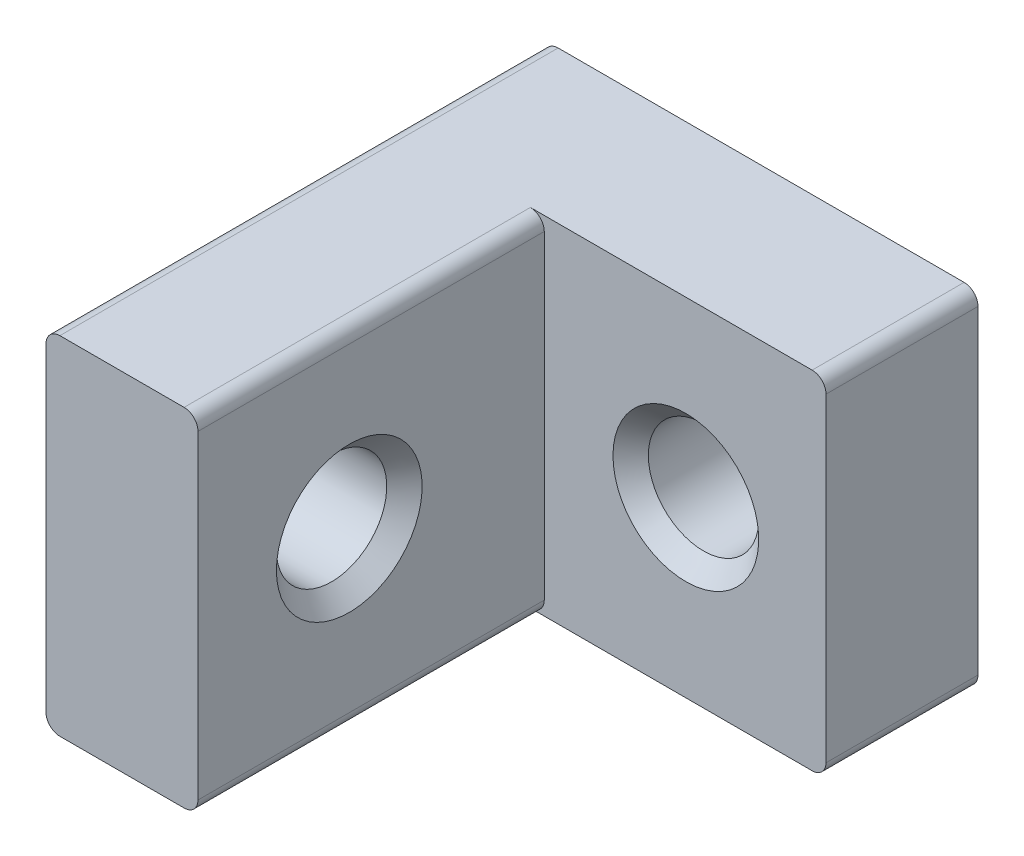
ISO-10303-21;
HEADER;
FILE_DESCRIPTION(('STEP AP214'),'2;1');
FILE_NAME('part.step','',(''),(''),'','','');
FILE_SCHEMA(('AUTOMOTIVE_DESIGN { 1 0 10303 214 1 1 1 1 }'));
ENDSEC;
DATA;
#1=APPLICATION_CONTEXT('core data for automotive mechanical design processes');
#2=APPLICATION_PROTOCOL_DEFINITION('international standard','automotive_design',2000,#1);
#3=PRODUCT_CONTEXT('',#1,'mechanical');
#4=PRODUCT('Part','Part','',(#3));
#5=PRODUCT_RELATED_PRODUCT_CATEGORY('part','',(#4));
#6=PRODUCT_DEFINITION_FORMATION('','',#4);
#7=PRODUCT_DEFINITION_CONTEXT('part definition',#1,'design');
#8=PRODUCT_DEFINITION('design','',#6,#7);
#9=PRODUCT_DEFINITION_SHAPE('','',#8);
#10=(LENGTH_UNIT() NAMED_UNIT(*) SI_UNIT(.MILLI.,.METRE.));
#11=(NAMED_UNIT(*) PLANE_ANGLE_UNIT() SI_UNIT($,.RADIAN.));
#12=(NAMED_UNIT(*) SI_UNIT($,.STERADIAN.) SOLID_ANGLE_UNIT());
#13=UNCERTAINTY_MEASURE_WITH_UNIT(LENGTH_MEASURE(1.E-05),#10,'distance_accuracy_value','');
#14=(GEOMETRIC_REPRESENTATION_CONTEXT(3) GLOBAL_UNCERTAINTY_ASSIGNED_CONTEXT((#13)) GLOBAL_UNIT_ASSIGNED_CONTEXT((#10,
#11,#12)) REPRESENTATION_CONTEXT('',''));
#15=CARTESIAN_POINT('',(0.,0.,0.));
#16=DIRECTION('',(0.,0.,1.));
#17=DIRECTION('',(1.,0.,0.));
#18=AXIS2_PLACEMENT_3D('',#15,#16,#17);
#19=CARTESIAN_POINT('',(0.381,6.35,0.));
#20=DIRECTION('',(1.,0.,0.));
#21=DIRECTION('',(0.,0.,-1.));
#22=AXIS2_PLACEMENT_3D('',#19,#20,#21);
#23=PLANE('',#22);
#24=CARTESIAN_POINT('',(0.381000000000002,0.,12.7));
#25=DIRECTION('',(-1.,0.,0.));
#26=DIRECTION('',(0.,0.,1.));
#27=AXIS2_PLACEMENT_3D('',#24,#25,#26);
#28=CIRCLE('',#27,2.667);
#29=CARTESIAN_POINT('',(0.381000000000002,0.,15.367));
#30=VERTEX_POINT('',#29);
#31=EDGE_CURVE('E252',#30,#30,#28,.T.);
#32=ORIENTED_EDGE('',*,*,#31,.F.);
#33=EDGE_LOOP('',(#32));
#34=FACE_BOUND('',#33,.T.);
#35=DIRECTION('',(0.,-1.,0.));
#36=VECTOR('',#35,1.);
#37=CARTESIAN_POINT('',(0.381,6.35,0.));
#38=LINE('',#37,#36);
#39=CARTESIAN_POINT('',(0.381,5.842,0.));
#40=VERTEX_POINT('',#39);
#41=CARTESIAN_POINT('',(0.381,-5.842,0.));
#42=VERTEX_POINT('',#41);
#43=EDGE_CURVE('E222',#40,#42,#38,.T.);
#44=ORIENTED_EDGE('',*,*,#43,.T.);
#45=DIRECTION('',(0.,0.,1.));
#46=VECTOR('',#45,1.);
#47=CARTESIAN_POINT('',(0.381,-5.842,0.));
#48=LINE('',#47,#46);
#49=CARTESIAN_POINT('',(0.381000000000002,-5.842,18.2372));
#50=VERTEX_POINT('',#49);
#51=EDGE_CURVE('E146',#42,#50,#48,.T.);
#52=ORIENTED_EDGE('',*,*,#51,.T.);
#53=DIRECTION('',(0.,-1.,0.));
#54=VECTOR('',#53,1.);
#55=CARTESIAN_POINT('',(0.381000000000002,6.35,18.2372));
#56=LINE('',#55,#54);
#57=CARTESIAN_POINT('',(0.381000000000002,5.842,18.2372));
#58=VERTEX_POINT('',#57);
#59=EDGE_CURVE('E130',#58,#50,#56,.T.);
#60=ORIENTED_EDGE('',*,*,#59,.F.);
#61=DIRECTION('',(0.,0.,1.));
#62=VECTOR('',#61,1.);
#63=CARTESIAN_POINT('',(0.381,5.842,0.));
#64=LINE('',#63,#62);
#65=EDGE_CURVE('E143',#58,#40,#64,.F.);
#66=ORIENTED_EDGE('',*,*,#65,.T.);
#67=EDGE_LOOP('',(#44,#52,#60,#66));
#68=FACE_BOUND('',#67,.T.);
#69=ADVANCED_FACE('F36',(#34,#68),#23,.F.);
#70=CARTESIAN_POINT('',(0.381000000000002,6.35,18.2372));
#71=DIRECTION('',(0.,0.,-1.));
#72=DIRECTION('',(-1.,0.,0.));
#73=AXIS2_PLACEMENT_3D('',#70,#71,#72);
#74=PLANE('',#73);
#75=ORIENTED_EDGE('',*,*,#59,.T.);
#76=CARTESIAN_POINT('',(0.889000000000002,-5.842,18.2372));
#77=DIRECTION('',(0.,0.,-1.));
#78=DIRECTION('',(-1.,0.,0.));
#79=AXIS2_PLACEMENT_3D('',#76,#77,#78);
#80=CIRCLE('',#79,0.508);
#81=CARTESIAN_POINT('',(0.889000000000002,-6.35,18.2372));
#82=VERTEX_POINT('',#81);
#83=EDGE_CURVE('E137',#50,#82,#80,.F.);
#84=ORIENTED_EDGE('',*,*,#83,.T.);
#85=DIRECTION('',(1.,0.,0.));
#86=VECTOR('',#85,1.);
#87=CARTESIAN_POINT('',(0.381000000000002,-6.35,18.2372));
#88=LINE('',#87,#86);
#89=CARTESIAN_POINT('',(5.4356,-6.35,18.2372));
#90=VERTEX_POINT('',#89);
#91=EDGE_CURVE('E205',#82,#90,#88,.T.);
#92=ORIENTED_EDGE('',*,*,#91,.T.);
#93=CARTESIAN_POINT('',(5.4356,-5.842,18.2372));
#94=DIRECTION('',(0.,0.,-1.));
#95=DIRECTION('',(-1.,0.,0.));
#96=AXIS2_PLACEMENT_3D('',#93,#94,#95);
#97=CIRCLE('',#96,0.508);
#98=CARTESIAN_POINT('',(5.9436,-5.842,18.2372));
#99=VERTEX_POINT('',#98);
#100=EDGE_CURVE('E138',#90,#99,#97,.F.);
#101=ORIENTED_EDGE('',*,*,#100,.T.);
#102=DIRECTION('',(0.,-1.,0.));
#103=VECTOR('',#102,1.);
#104=CARTESIAN_POINT('',(5.9436,6.35,18.2372));
#105=LINE('',#104,#103);
#106=CARTESIAN_POINT('',(5.9436,5.842,18.2372));
#107=VERTEX_POINT('',#106);
#108=EDGE_CURVE('E148',#107,#99,#105,.T.);
#109=ORIENTED_EDGE('',*,*,#108,.F.);
#110=CARTESIAN_POINT('',(5.4356,5.842,18.2372));
#111=DIRECTION('',(0.,0.,-1.));
#112=DIRECTION('',(-1.,0.,0.));
#113=AXIS2_PLACEMENT_3D('',#110,#111,#112);
#114=CIRCLE('',#113,0.508);
#115=CARTESIAN_POINT('',(5.4356,6.35,18.2372));
#116=VERTEX_POINT('',#115);
#117=EDGE_CURVE('E154',#107,#116,#114,.F.);
#118=ORIENTED_EDGE('',*,*,#117,.T.);
#119=DIRECTION('',(1.,0.,0.));
#120=VECTOR('',#119,1.);
#121=CARTESIAN_POINT('',(0.381000000000002,6.35,18.2372));
#122=LINE('',#121,#120);
#123=CARTESIAN_POINT('',(0.889000000000002,6.35,18.2372));
#124=VERTEX_POINT('',#123);
#125=EDGE_CURVE('E132',#124,#116,#122,.T.);
#126=ORIENTED_EDGE('',*,*,#125,.F.);
#127=CARTESIAN_POINT('',(0.889000000000002,5.842,18.2372));
#128=DIRECTION('',(0.,0.,-1.));
#129=DIRECTION('',(-1.,0.,0.));
#130=AXIS2_PLACEMENT_3D('',#127,#128,#129);
#131=CIRCLE('',#130,0.508);
#132=EDGE_CURVE('E127',#124,#58,#131,.F.);
#133=ORIENTED_EDGE('',*,*,#132,.T.);
#134=EDGE_LOOP('',(#75,#84,#92,#101,#109,#118,#126,#133));
#135=FACE_BOUND('',#134,.T.);
#136=ADVANCED_FACE('F129',(#135),#74,.F.);
#137=CARTESIAN_POINT('',(5.9436,6.35,18.2372));
#138=DIRECTION('',(-1.,0.,0.));
#139=DIRECTION('',(0.,0.,1.));
#140=AXIS2_PLACEMENT_3D('',#137,#138,#139);
#141=PLANE('',#140);
#142=CARTESIAN_POINT('',(5.9436,0.,12.7));
#143=DIRECTION('',(-1.,0.,0.));
#144=DIRECTION('',(0.,0.,1.));
#145=AXIS2_PLACEMENT_3D('',#142,#143,#144);
#146=CIRCLE('',#145,2.667);
#147=CARTESIAN_POINT('',(5.9436,0.,15.367));
#148=VERTEX_POINT('',#147);
#149=EDGE_CURVE('E209',#148,#148,#146,.T.);
#150=ORIENTED_EDGE('',*,*,#149,.T.);
#151=EDGE_LOOP('',(#150));
#152=FACE_BOUND('',#151,.T.);
#153=ORIENTED_EDGE('',*,*,#108,.T.);
#154=DIRECTION('',(0.,0.,-1.));
#155=VECTOR('',#154,1.);
#156=CARTESIAN_POINT('',(5.9436,-5.842,18.2372));
#157=LINE('',#156,#155);
#158=CARTESIAN_POINT('',(5.9436,-5.842,5.5626));
#159=VERTEX_POINT('',#158);
#160=EDGE_CURVE('E193',#99,#159,#157,.T.);
#161=ORIENTED_EDGE('',*,*,#160,.T.);
#162=DIRECTION('',(0.,-1.,0.));
#163=VECTOR('',#162,1.);
#164=CARTESIAN_POINT('',(5.9436,6.35,5.5626));
#165=LINE('',#164,#163);
#166=CARTESIAN_POINT('',(5.9436,5.842,5.5626));
#167=VERTEX_POINT('',#166);
#168=EDGE_CURVE('E198',#167,#159,#165,.T.);
#169=ORIENTED_EDGE('',*,*,#168,.F.);
#170=DIRECTION('',(0.,0.,-1.));
#171=VECTOR('',#170,1.);
#172=CARTESIAN_POINT('',(5.9436,5.842,18.2372));
#173=LINE('',#172,#171);
#174=EDGE_CURVE('E191',#167,#107,#173,.F.);
#175=ORIENTED_EDGE('',*,*,#174,.T.);
#176=EDGE_LOOP('',(#153,#161,#169,#175));
#177=FACE_BOUND('',#176,.T.);
#178=ADVANCED_FACE('F234',(#152,#177),#141,.F.);
#179=CARTESIAN_POINT('',(5.9436,6.35,5.5626));
#180=DIRECTION('',(0.,0.,-1.));
#181=DIRECTION('',(-1.,0.,0.));
#182=AXIS2_PLACEMENT_3D('',#179,#180,#181);
#183=PLANE('',#182);
#184=CARTESIAN_POINT('',(11.1252,0.,5.5626));
#185=DIRECTION('',(0.,0.,-1.));
#186=DIRECTION('',(-1.,0.,0.));
#187=AXIS2_PLACEMENT_3D('',#184,#185,#186);
#188=CIRCLE('',#187,2.667);
#189=CARTESIAN_POINT('',(8.4582,0.,5.5626));
#190=VERTEX_POINT('',#189);
#191=EDGE_CURVE('E256',#190,#190,#188,.T.);
#192=ORIENTED_EDGE('',*,*,#191,.T.);
#193=EDGE_LOOP('',(#192));
#194=FACE_BOUND('',#193,.T.);
#195=DIRECTION('',(1.,0.,0.));
#196=VECTOR('',#195,1.);
#197=CARTESIAN_POINT('',(5.9436,-6.35,5.5626));
#198=LINE('',#197,#196);
#199=CARTESIAN_POINT('',(5.4356,-6.35,5.5626));
#200=VERTEX_POINT('',#199);
#201=CARTESIAN_POINT('',(15.748,-6.35,5.5626));
#202=VERTEX_POINT('',#201);
#203=EDGE_CURVE('E196',#200,#202,#198,.T.);
#204=ORIENTED_EDGE('',*,*,#203,.T.);
#205=CARTESIAN_POINT('',(15.748,-5.842,5.5626));
#206=DIRECTION('',(0.,0.,-1.));
#207=DIRECTION('',(-1.,0.,0.));
#208=AXIS2_PLACEMENT_3D('',#205,#206,#207);
#209=CIRCLE('',#208,0.508);
#210=CARTESIAN_POINT('',(16.256,-5.842,5.5626));
#211=VERTEX_POINT('',#210);
#212=EDGE_CURVE('E189',#202,#211,#209,.F.);
#213=ORIENTED_EDGE('',*,*,#212,.T.);
#214=DIRECTION('',(0.,-1.,0.));
#215=VECTOR('',#214,1.);
#216=CARTESIAN_POINT('',(16.256,6.35,5.5626));
#217=LINE('',#216,#215);
#218=CARTESIAN_POINT('',(16.256,5.842,5.5626));
#219=VERTEX_POINT('',#218);
#220=EDGE_CURVE('E229',#219,#211,#217,.T.);
#221=ORIENTED_EDGE('',*,*,#220,.F.);
#222=CARTESIAN_POINT('',(15.748,5.842,5.5626));
#223=DIRECTION('',(0.,0.,-1.));
#224=DIRECTION('',(-1.,0.,0.));
#225=AXIS2_PLACEMENT_3D('',#222,#223,#224);
#226=CIRCLE('',#225,0.508);
#227=CARTESIAN_POINT('',(15.748,6.35,5.5626));
#228=VERTEX_POINT('',#227);
#229=EDGE_CURVE('E187',#219,#228,#226,.F.);
#230=ORIENTED_EDGE('',*,*,#229,.T.);
#231=DIRECTION('',(1.,0.,0.));
#232=VECTOR('',#231,1.);
#233=CARTESIAN_POINT('',(5.9436,6.35,5.5626));
#234=LINE('',#233,#232);
#235=CARTESIAN_POINT('',(5.4356,6.35,5.5626));
#236=VERTEX_POINT('',#235);
#237=EDGE_CURVE('E243',#236,#228,#234,.T.);
#238=ORIENTED_EDGE('',*,*,#237,.F.);
#239=CARTESIAN_POINT('',(5.4356,5.842,5.5626));
#240=DIRECTION('',(0.,0.,-1.));
#241=DIRECTION('',(-1.,0.,0.));
#242=AXIS2_PLACEMENT_3D('',#239,#240,#241);
#243=CIRCLE('',#242,0.508);
#244=EDGE_CURVE('E11',#236,#167,#243,.T.);
#245=ORIENTED_EDGE('',*,*,#244,.T.);
#246=ORIENTED_EDGE('',*,*,#168,.T.);
#247=CARTESIAN_POINT('',(5.4356,-5.842,5.5626));
#248=DIRECTION('',(0.,0.,-1.));
#249=DIRECTION('',(-1.,0.,0.));
#250=AXIS2_PLACEMENT_3D('',#247,#248,#249);
#251=CIRCLE('',#250,0.508);
#252=EDGE_CURVE('E44',#159,#200,#251,.T.);
#253=ORIENTED_EDGE('',*,*,#252,.T.);
#254=EDGE_LOOP('',(#204,#213,#221,#230,#238,#245,#246,#253));
#255=FACE_BOUND('',#254,.T.);
#256=ADVANCED_FACE('F195',(#194,#255),#183,.F.);
#257=CARTESIAN_POINT('',(16.256,6.35,0.));
#258=DIRECTION('',(-1.,0.,0.));
#259=DIRECTION('',(0.,0.,1.));
#260=AXIS2_PLACEMENT_3D('',#257,#258,#259);
#261=PLANE('',#260);
#262=ORIENTED_EDGE('',*,*,#220,.T.);
#263=DIRECTION('',(0.,0.,-1.));
#264=VECTOR('',#263,1.);
#265=CARTESIAN_POINT('',(16.256,-5.842,0.));
#266=LINE('',#265,#264);
#267=CARTESIAN_POINT('',(16.256,-5.842,0.));
#268=VERTEX_POINT('',#267);
#269=EDGE_CURVE('E184',#211,#268,#266,.T.);
#270=ORIENTED_EDGE('',*,*,#269,.T.);
#271=DIRECTION('',(0.,-1.,0.));
#272=VECTOR('',#271,1.);
#273=CARTESIAN_POINT('',(16.256,6.35,0.));
#274=LINE('',#273,#272);
#275=CARTESIAN_POINT('',(16.256,5.842,0.));
#276=VERTEX_POINT('',#275);
#277=EDGE_CURVE('E225',#276,#268,#274,.T.);
#278=ORIENTED_EDGE('',*,*,#277,.F.);
#279=DIRECTION('',(0.,0.,-1.));
#280=VECTOR('',#279,1.);
#281=CARTESIAN_POINT('',(16.256,5.842,5.5626));
#282=LINE('',#281,#280);
#283=EDGE_CURVE('E182',#276,#219,#282,.F.);
#284=ORIENTED_EDGE('',*,*,#283,.T.);
#285=EDGE_LOOP('',(#262,#270,#278,#284));
#286=FACE_BOUND('',#285,.T.);
#287=ADVANCED_FACE('F277',(#286),#261,.F.);
#288=CARTESIAN_POINT('',(0.381,6.35,0.));
#289=DIRECTION('',(0.,0.,1.));
#290=DIRECTION('',(1.,0.,0.));
#291=AXIS2_PLACEMENT_3D('',#288,#289,#290);
#292=PLANE('',#291);
#293=CARTESIAN_POINT('',(11.1252,0.,0.));
#294=DIRECTION('',(0.,0.,-1.));
#295=DIRECTION('',(-1.,0.,0.));
#296=AXIS2_PLACEMENT_3D('',#293,#294,#295);
#297=CIRCLE('',#296,2.667);
#298=CARTESIAN_POINT('',(8.4582,0.,0.));
#299=VERTEX_POINT('',#298);
#300=EDGE_CURVE('E266',#299,#299,#297,.T.);
#301=ORIENTED_EDGE('',*,*,#300,.F.);
#302=EDGE_LOOP('',(#301));
#303=FACE_BOUND('',#302,.T.);
#304=DIRECTION('',(-1.,0.,0.));
#305=VECTOR('',#304,1.);
#306=CARTESIAN_POINT('',(0.381,-6.35,0.));
#307=LINE('',#306,#305);
#308=CARTESIAN_POINT('',(15.748,-6.35,0.));
#309=VERTEX_POINT('',#308);
#310=CARTESIAN_POINT('',(0.889,-6.35,0.));
#311=VERTEX_POINT('',#310);
#312=EDGE_CURVE('E211',#309,#311,#307,.T.);
#313=ORIENTED_EDGE('',*,*,#312,.T.);
#314=CARTESIAN_POINT('',(0.889,-5.842,0.));
#315=DIRECTION('',(0.,0.,1.));
#316=DIRECTION('',(1.,0.,0.));
#317=AXIS2_PLACEMENT_3D('',#314,#315,#316);
#318=CIRCLE('',#317,0.508);
#319=EDGE_CURVE('E172',#311,#42,#318,.F.);
#320=ORIENTED_EDGE('',*,*,#319,.T.);
#321=ORIENTED_EDGE('',*,*,#43,.F.);
#322=CARTESIAN_POINT('',(0.889,5.842,0.));
#323=DIRECTION('',(0.,0.,1.));
#324=DIRECTION('',(1.,0.,0.));
#325=AXIS2_PLACEMENT_3D('',#322,#323,#324);
#326=CIRCLE('',#325,0.508);
#327=CARTESIAN_POINT('',(0.889,6.35,0.));
#328=VERTEX_POINT('',#327);
#329=EDGE_CURVE('E152',#40,#328,#326,.F.);
#330=ORIENTED_EDGE('',*,*,#329,.T.);
#331=DIRECTION('',(-1.,0.,0.));
#332=VECTOR('',#331,1.);
#333=CARTESIAN_POINT('',(0.381,6.35,0.));
#334=LINE('',#333,#332);
#335=CARTESIAN_POINT('',(15.748,6.35,0.));
#336=VERTEX_POINT('',#335);
#337=EDGE_CURVE('E217',#336,#328,#334,.T.);
#338=ORIENTED_EDGE('',*,*,#337,.F.);
#339=CARTESIAN_POINT('',(15.748,5.842,0.));
#340=DIRECTION('',(0.,0.,1.));
#341=DIRECTION('',(1.,0.,0.));
#342=AXIS2_PLACEMENT_3D('',#339,#340,#341);
#343=CIRCLE('',#342,0.508);
#344=EDGE_CURVE('E167',#336,#276,#343,.F.);
#345=ORIENTED_EDGE('',*,*,#344,.T.);
#346=ORIENTED_EDGE('',*,*,#277,.T.);
#347=CARTESIAN_POINT('',(15.748,-5.842,0.));
#348=DIRECTION('',(0.,0.,1.));
#349=DIRECTION('',(1.,0.,0.));
#350=AXIS2_PLACEMENT_3D('',#347,#348,#349);
#351=CIRCLE('',#350,0.508);
#352=EDGE_CURVE('E169',#268,#309,#351,.F.);
#353=ORIENTED_EDGE('',*,*,#352,.T.);
#354=EDGE_LOOP('',(#313,#320,#321,#330,#338,#345,#346,#353));
#355=FACE_BOUND('',#354,.T.);
#356=ADVANCED_FACE('F274',(#303,#355),#292,.F.);
#357=CARTESIAN_POINT('',(0.381000000000002,6.35,18.2372));
#358=DIRECTION('',(0.,1.,0.));
#359=DIRECTION('',(0.,0.,1.));
#360=AXIS2_PLACEMENT_3D('',#357,#358,#359);
#361=PLANE('',#360);
#362=ORIENTED_EDGE('',*,*,#337,.T.);
#363=DIRECTION('',(0.,0.,1.));
#364=VECTOR('',#363,1.);
#365=CARTESIAN_POINT('',(0.889000000000002,6.35,18.2372));
#366=LINE('',#365,#364);
#367=EDGE_CURVE('E180',#328,#124,#366,.T.);
#368=ORIENTED_EDGE('',*,*,#367,.T.);
#369=ORIENTED_EDGE('',*,*,#125,.T.);
#370=DIRECTION('',(0.,0.,-1.));
#371=VECTOR('',#370,1.);
#372=CARTESIAN_POINT('',(5.4356,6.35,5.5626));
#373=LINE('',#372,#371);
#374=EDGE_CURVE('E174',#116,#236,#373,.T.);
#375=ORIENTED_EDGE('',*,*,#374,.T.);
#376=ORIENTED_EDGE('',*,*,#237,.T.);
#377=DIRECTION('',(0.,0.,-1.));
#378=VECTOR('',#377,1.);
#379=CARTESIAN_POINT('',(15.748,6.35,0.));
#380=LINE('',#379,#378);
#381=EDGE_CURVE('E177',#228,#336,#380,.T.);
#382=ORIENTED_EDGE('',*,*,#381,.T.);
#383=EDGE_LOOP('',(#362,#368,#369,#375,#376,#382));
#384=FACE_BOUND('',#383,.T.);
#385=ADVANCED_FACE('F242',(#384),#361,.T.);
#386=CARTESIAN_POINT('',(0.381000000000002,-6.35,18.2372));
#387=DIRECTION('',(0.,1.,0.));
#388=DIRECTION('',(0.,0.,1.));
#389=AXIS2_PLACEMENT_3D('',#386,#387,#388);
#390=PLANE('',#389);
#391=ORIENTED_EDGE('',*,*,#91,.F.);
#392=DIRECTION('',(0.,0.,1.));
#393=VECTOR('',#392,1.);
#394=CARTESIAN_POINT('',(0.889000000000002,-6.35,18.2372));
#395=LINE('',#394,#393);
#396=EDGE_CURVE('E165',#82,#311,#395,.F.);
#397=ORIENTED_EDGE('',*,*,#396,.T.);
#398=ORIENTED_EDGE('',*,*,#312,.F.);
#399=DIRECTION('',(0.,0.,-1.));
#400=VECTOR('',#399,1.);
#401=CARTESIAN_POINT('',(15.748,-6.35,18.2372));
#402=LINE('',#401,#400);
#403=EDGE_CURVE('E163',#309,#202,#402,.F.);
#404=ORIENTED_EDGE('',*,*,#403,.T.);
#405=ORIENTED_EDGE('',*,*,#203,.F.);
#406=DIRECTION('',(0.,0.,-1.));
#407=VECTOR('',#406,1.);
#408=CARTESIAN_POINT('',(5.4356,-6.35,18.2372));
#409=LINE('',#408,#407);
#410=EDGE_CURVE('E161',#200,#90,#409,.F.);
#411=ORIENTED_EDGE('',*,*,#410,.T.);
#412=EDGE_LOOP('',(#391,#397,#398,#404,#405,#411));
#413=FACE_BOUND('',#412,.T.);
#414=ADVANCED_FACE('F204',(#413),#390,.F.);
#415=CARTESIAN_POINT('',(5.2959,0.,12.7));
#416=DIRECTION('',(1.,0.,0.));
#417=DIRECTION('',(0.,0.,-1.));
#418=AXIS2_PLACEMENT_3D('',#415,#416,#417);
#419=CONICAL_SURFACE('',#418,2.0193,0.785398163397447);
#420=ORIENTED_EDGE('',*,*,#149,.F.);
#421=EDGE_LOOP('',(#420));
#422=FACE_BOUND('',#421,.T.);
#423=CARTESIAN_POINT('',(5.2959,0.,12.7));
#424=DIRECTION('',(-1.,0.,0.));
#425=DIRECTION('',(0.,0.,1.));
#426=AXIS2_PLACEMENT_3D('',#423,#424,#425);
#427=CIRCLE('',#426,2.0193);
#428=CARTESIAN_POINT('',(5.2959,0.,14.7193));
#429=VERTEX_POINT('',#428);
#430=EDGE_CURVE('E214',#429,#429,#427,.T.);
#431=ORIENTED_EDGE('',*,*,#430,.T.);
#432=EDGE_LOOP('',(#431));
#433=FACE_BOUND('',#432,.T.);
#434=ADVANCED_FACE('F315',(#422,#433),#419,.F.);
#435=CARTESIAN_POINT('',(0.381000000000002,0.,12.7));
#436=DIRECTION('',(-1.,0.,0.));
#437=DIRECTION('',(0.,0.,1.));
#438=AXIS2_PLACEMENT_3D('',#435,#436,#437);
#439=CYLINDRICAL_SURFACE('',#438,2.0193);
#440=ORIENTED_EDGE('',*,*,#430,.F.);
#441=EDGE_LOOP('',(#440));
#442=FACE_BOUND('',#441,.T.);
#443=CARTESIAN_POINT('',(1.0287,0.,12.7));
#444=DIRECTION('',(-1.,0.,0.));
#445=DIRECTION('',(0.,0.,1.));
#446=AXIS2_PLACEMENT_3D('',#443,#444,#445);
#447=CIRCLE('',#446,2.0193);
#448=CARTESIAN_POINT('',(1.0287,0.,14.7193));
#449=VERTEX_POINT('',#448);
#450=EDGE_CURVE('E249',#449,#449,#447,.T.);
#451=ORIENTED_EDGE('',*,*,#450,.T.);
#452=EDGE_LOOP('',(#451));
#453=FACE_BOUND('',#452,.T.);
#454=ADVANCED_FACE('F320',(#442,#453),#439,.F.);
#455=CARTESIAN_POINT('',(0.381000000000002,0.,12.7));
#456=DIRECTION('',(-1.,0.,0.));
#457=DIRECTION('',(0.,0.,1.));
#458=AXIS2_PLACEMENT_3D('',#455,#456,#457);
#459=CONICAL_SURFACE('',#458,2.667,0.785398163397449);
#460=ORIENTED_EDGE('',*,*,#450,.F.);
#461=EDGE_LOOP('',(#460));
#462=FACE_BOUND('',#461,.T.);
#463=ORIENTED_EDGE('',*,*,#31,.T.);
#464=EDGE_LOOP('',(#463));
#465=FACE_BOUND('',#464,.T.);
#466=ADVANCED_FACE('F324',(#462,#465),#459,.F.);
#467=CARTESIAN_POINT('',(11.1252,0.,4.9149));
#468=DIRECTION('',(0.,0.,1.));
#469=DIRECTION('',(1.,0.,0.));
#470=AXIS2_PLACEMENT_3D('',#467,#468,#469);
#471=CONICAL_SURFACE('',#470,2.0193,0.785398163397448);
#472=ORIENTED_EDGE('',*,*,#191,.F.);
#473=EDGE_LOOP('',(#472));
#474=FACE_BOUND('',#473,.T.);
#475=CARTESIAN_POINT('',(11.1252,0.,4.9149));
#476=DIRECTION('',(0.,0.,-1.));
#477=DIRECTION('',(-1.,0.,0.));
#478=AXIS2_PLACEMENT_3D('',#475,#476,#477);
#479=CIRCLE('',#478,2.0193);
#480=CARTESIAN_POINT('',(9.1059,0.,4.9149));
#481=VERTEX_POINT('',#480);
#482=EDGE_CURVE('E260',#481,#481,#479,.T.);
#483=ORIENTED_EDGE('',*,*,#482,.T.);
#484=EDGE_LOOP('',(#483));
#485=FACE_BOUND('',#484,.T.);
#486=ADVANCED_FACE('F328',(#474,#485),#471,.F.);
#487=CARTESIAN_POINT('',(11.1252,0.,0.));
#488=DIRECTION('',(0.,0.,-1.));
#489=DIRECTION('',(-1.,0.,0.));
#490=AXIS2_PLACEMENT_3D('',#487,#488,#489);
#491=CYLINDRICAL_SURFACE('',#490,2.0193);
#492=ORIENTED_EDGE('',*,*,#482,.F.);
#493=EDGE_LOOP('',(#492));
#494=FACE_BOUND('',#493,.T.);
#495=CARTESIAN_POINT('',(11.1252,0.,0.647699999999999));
#496=DIRECTION('',(0.,0.,-1.));
#497=DIRECTION('',(-1.,0.,0.));
#498=AXIS2_PLACEMENT_3D('',#495,#496,#497);
#499=CIRCLE('',#498,2.0193);
#500=CARTESIAN_POINT('',(9.1059,0.,0.647699999999999));
#501=VERTEX_POINT('',#500);
#502=EDGE_CURVE('E263',#501,#501,#499,.T.);
#503=ORIENTED_EDGE('',*,*,#502,.T.);
#504=EDGE_LOOP('',(#503));
#505=FACE_BOUND('',#504,.T.);
#506=ADVANCED_FACE('F292',(#494,#505),#491,.F.);
#507=CARTESIAN_POINT('',(11.1252,0.,0.));
#508=DIRECTION('',(0.,0.,-1.));
#509=DIRECTION('',(-1.,0.,0.));
#510=AXIS2_PLACEMENT_3D('',#507,#508,#509);
#511=CONICAL_SURFACE('',#510,2.667,0.785398163397448);
#512=ORIENTED_EDGE('',*,*,#502,.F.);
#513=EDGE_LOOP('',(#512));
#514=FACE_BOUND('',#513,.T.);
#515=ORIENTED_EDGE('',*,*,#300,.T.);
#516=EDGE_LOOP('',(#515));
#517=FACE_BOUND('',#516,.T.);
#518=ADVANCED_FACE('F272',(#514,#517),#511,.F.);
#519=CARTESIAN_POINT('',(0.889,-5.842,0.));
#520=DIRECTION('',(0.,0.,1.));
#521=DIRECTION('',(1.,0.,0.));
#522=AXIS2_PLACEMENT_3D('',#519,#520,#521);
#523=CYLINDRICAL_SURFACE('',#522,0.508);
#524=ORIENTED_EDGE('',*,*,#319,.F.);
#525=ORIENTED_EDGE('',*,*,#396,.F.);
#526=ORIENTED_EDGE('',*,*,#83,.F.);
#527=ORIENTED_EDGE('',*,*,#51,.F.);
#528=EDGE_LOOP('',(#524,#525,#526,#527));
#529=FACE_BOUND('',#528,.T.);
#530=ADVANCED_FACE('F283',(#529),#523,.T.);
#531=CARTESIAN_POINT('',(0.889000000000002,5.842,18.2372));
#532=DIRECTION('',(0.,0.,-1.));
#533=DIRECTION('',(-1.,0.,0.));
#534=AXIS2_PLACEMENT_3D('',#531,#532,#533);
#535=CYLINDRICAL_SURFACE('',#534,0.508);
#536=ORIENTED_EDGE('',*,*,#329,.F.);
#537=ORIENTED_EDGE('',*,*,#65,.F.);
#538=ORIENTED_EDGE('',*,*,#132,.F.);
#539=ORIENTED_EDGE('',*,*,#367,.F.);
#540=EDGE_LOOP('',(#536,#537,#538,#539));
#541=FACE_BOUND('',#540,.T.);
#542=ADVANCED_FACE('F151',(#541),#535,.T.);
#543=CARTESIAN_POINT('',(15.748,-5.842,0.));
#544=DIRECTION('',(0.,0.,-1.));
#545=DIRECTION('',(-1.,0.,0.));
#546=AXIS2_PLACEMENT_3D('',#543,#544,#545);
#547=CYLINDRICAL_SURFACE('',#546,0.508);
#548=ORIENTED_EDGE('',*,*,#212,.F.);
#549=ORIENTED_EDGE('',*,*,#403,.F.);
#550=ORIENTED_EDGE('',*,*,#352,.F.);
#551=ORIENTED_EDGE('',*,*,#269,.F.);
#552=EDGE_LOOP('',(#548,#549,#550,#551));
#553=FACE_BOUND('',#552,.T.);
#554=ADVANCED_FACE('F290',(#553),#547,.T.);
#555=CARTESIAN_POINT('',(15.748,5.842,18.2372));
#556=DIRECTION('',(0.,0.,1.));
#557=DIRECTION('',(1.,0.,0.));
#558=AXIS2_PLACEMENT_3D('',#555,#556,#557);
#559=CYLINDRICAL_SURFACE('',#558,0.508);
#560=ORIENTED_EDGE('',*,*,#229,.F.);
#561=ORIENTED_EDGE('',*,*,#283,.F.);
#562=ORIENTED_EDGE('',*,*,#344,.F.);
#563=ORIENTED_EDGE('',*,*,#381,.F.);
#564=EDGE_LOOP('',(#560,#561,#562,#563));
#565=FACE_BOUND('',#564,.T.);
#566=ADVANCED_FACE('F368',(#565),#559,.T.);
#567=CARTESIAN_POINT('',(5.4356,-5.842,18.2372));
#568=DIRECTION('',(0.,0.,-1.));
#569=DIRECTION('',(-1.,0.,0.));
#570=AXIS2_PLACEMENT_3D('',#567,#568,#569);
#571=CYLINDRICAL_SURFACE('',#570,0.508);
#572=ORIENTED_EDGE('',*,*,#100,.F.);
#573=ORIENTED_EDGE('',*,*,#410,.F.);
#574=ORIENTED_EDGE('',*,*,#252,.F.);
#575=ORIENTED_EDGE('',*,*,#160,.F.);
#576=EDGE_LOOP('',(#572,#573,#574,#575));
#577=FACE_BOUND('',#576,.T.);
#578=ADVANCED_FACE('F200',(#577),#571,.T.);
#579=CARTESIAN_POINT('',(5.4356,5.842,18.2372));
#580=DIRECTION('',(0.,0.,1.));
#581=DIRECTION('',(1.,0.,0.));
#582=AXIS2_PLACEMENT_3D('',#579,#580,#581);
#583=CYLINDRICAL_SURFACE('',#582,0.508);
#584=ORIENTED_EDGE('',*,*,#117,.F.);
#585=ORIENTED_EDGE('',*,*,#174,.F.);
#586=ORIENTED_EDGE('',*,*,#244,.F.);
#587=ORIENTED_EDGE('',*,*,#374,.F.);
#588=EDGE_LOOP('',(#584,#585,#586,#587));
#589=FACE_BOUND('',#588,.T.);
#590=ADVANCED_FACE('F38',(#589),#583,.T.);
#591=CLOSED_SHELL('',(#69,#136,#178,#256,#287,#356,#385,#414,#434,#454,#466,#486,#506,#518,#530,
#542,#554,#566,#578,#590));
#592=MANIFOLD_SOLID_BREP('B2',#591);
#593=ADVANCED_BREP_SHAPE_REPRESENTATION('',(#18,#592),#14);
#594=SHAPE_DEFINITION_REPRESENTATION(#9,#593);
ENDSEC;
END-ISO-10303-21;
